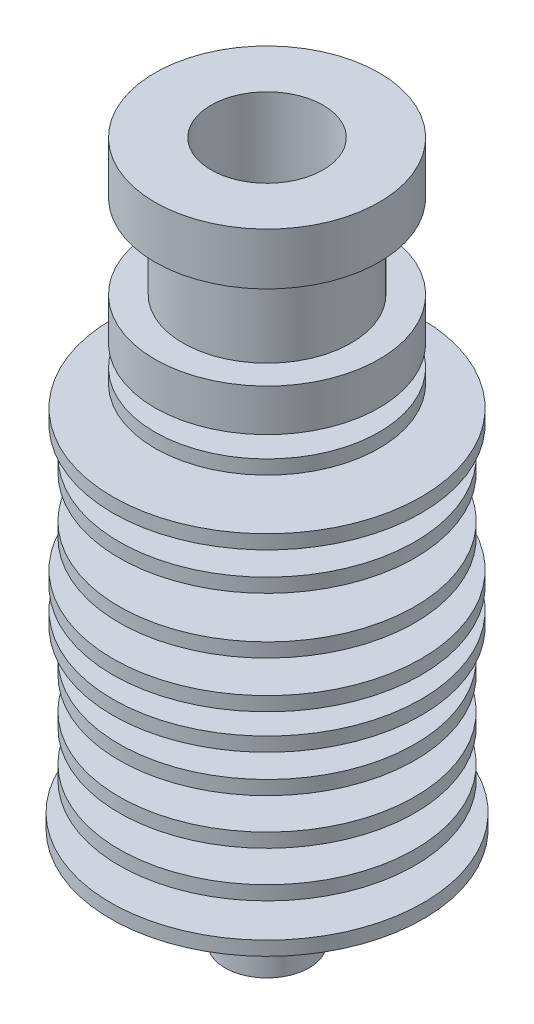
ISO-10303-21;
HEADER;
FILE_DESCRIPTION(('STEP AP214'),'2;1');
FILE_NAME('part.step','',(''),(''),'','','');
FILE_SCHEMA(('AUTOMOTIVE_DESIGN { 1 0 10303 214 1 1 1 1 }'));
ENDSEC;
DATA;
#1=APPLICATION_CONTEXT('core data for automotive mechanical design processes');
#2=APPLICATION_PROTOCOL_DEFINITION('international standard','automotive_design',2000,#1);
#3=PRODUCT_CONTEXT('',#1,'mechanical');
#4=PRODUCT('Part','Part','',(#3));
#5=PRODUCT_RELATED_PRODUCT_CATEGORY('part','',(#4));
#6=PRODUCT_DEFINITION_FORMATION('','',#4);
#7=PRODUCT_DEFINITION_CONTEXT('part definition',#1,'design');
#8=PRODUCT_DEFINITION('design','',#6,#7);
#9=PRODUCT_DEFINITION_SHAPE('','',#8);
#10=(LENGTH_UNIT() NAMED_UNIT(*) SI_UNIT(.MILLI.,.METRE.));
#11=(NAMED_UNIT(*) PLANE_ANGLE_UNIT() SI_UNIT($,.RADIAN.));
#12=(NAMED_UNIT(*) SI_UNIT($,.STERADIAN.) SOLID_ANGLE_UNIT());
#13=UNCERTAINTY_MEASURE_WITH_UNIT(LENGTH_MEASURE(1.E-05),#10,'distance_accuracy_value','');
#14=(GEOMETRIC_REPRESENTATION_CONTEXT(3) GLOBAL_UNCERTAINTY_ASSIGNED_CONTEXT((#13)) GLOBAL_UNIT_ASSIGNED_CONTEXT((#10,
#11,#12)) REPRESENTATION_CONTEXT('',''));
#15=CARTESIAN_POINT('',(0.,0.,0.));
#16=DIRECTION('',(0.,0.,1.));
#17=DIRECTION('',(1.,0.,0.));
#18=AXIS2_PLACEMENT_3D('',#15,#16,#17);
#19=CARTESIAN_POINT('',(0.,0.,0.));
#20=DIRECTION('',(0.,-1.,0.));
#21=DIRECTION('',(0.,0.,-1.));
#22=AXIS2_PLACEMENT_3D('',#19,#20,#21);
#23=CYLINDRICAL_SURFACE('',#22,8.);
#24=CARTESIAN_POINT('',(0.,0.,0.));
#25=DIRECTION('',(0.,-1.,0.));
#26=DIRECTION('',(0.,0.,-1.));
#27=AXIS2_PLACEMENT_3D('',#24,#25,#26);
#28=CIRCLE('',#27,8.);
#29=CARTESIAN_POINT('',(0.,0.,-8.));
#30=VERTEX_POINT('',#29);
#31=EDGE_CURVE('E199',#30,#30,#28,.T.);
#32=ORIENTED_EDGE('',*,*,#31,.T.);
#33=EDGE_LOOP('',(#32));
#34=FACE_BOUND('',#33,.T.);
#35=CARTESIAN_POINT('',(0.,-3.70000000000001,0.));
#36=DIRECTION('',(0.,-1.,0.));
#37=DIRECTION('',(0.,0.,-1.));
#38=AXIS2_PLACEMENT_3D('',#35,#36,#37);
#39=CIRCLE('',#38,8.);
#40=CARTESIAN_POINT('',(0.,-3.70000000000001,-8.));
#41=VERTEX_POINT('',#40);
#42=EDGE_CURVE('E10',#41,#41,#39,.T.);
#43=ORIENTED_EDGE('',*,*,#42,.F.);
#44=EDGE_LOOP('',(#43));
#45=FACE_BOUND('',#44,.T.);
#46=ADVANCED_FACE('F33',(#34,#45),#23,.T.);
#47=CARTESIAN_POINT('',(8.,-3.70000000000001,0.));
#48=DIRECTION('',(0.,-1.,0.));
#49=DIRECTION('',(0.,0.,-1.));
#50=AXIS2_PLACEMENT_3D('',#47,#48,#49);
#51=PLANE('',#50);
#52=ORIENTED_EDGE('',*,*,#42,.T.);
#53=EDGE_LOOP('',(#52));
#54=FACE_BOUND('',#53,.T.);
#55=CARTESIAN_POINT('',(0.,-3.70000000000001,0.));
#56=DIRECTION('',(0.,-1.,0.));
#57=DIRECTION('',(0.,0.,-1.));
#58=AXIS2_PLACEMENT_3D('',#55,#56,#57);
#59=CIRCLE('',#58,6.);
#60=CARTESIAN_POINT('',(0.,-3.70000000000001,-6.));
#61=VERTEX_POINT('',#60);
#62=EDGE_CURVE('E39',#61,#61,#59,.T.);
#63=ORIENTED_EDGE('',*,*,#62,.F.);
#64=EDGE_LOOP('',(#63));
#65=FACE_BOUND('',#64,.T.);
#66=ADVANCED_FACE('F217',(#54,#65),#51,.T.);
#67=CARTESIAN_POINT('',(0.,0.,0.));
#68=DIRECTION('',(0.,-1.,0.));
#69=DIRECTION('',(0.,0.,-1.));
#70=AXIS2_PLACEMENT_3D('',#67,#68,#69);
#71=CYLINDRICAL_SURFACE('',#70,6.);
#72=ORIENTED_EDGE('',*,*,#62,.T.);
#73=EDGE_LOOP('',(#72));
#74=FACE_BOUND('',#73,.T.);
#75=CARTESIAN_POINT('',(0.,-9.70000000000001,0.));
#76=DIRECTION('',(0.,-1.,0.));
#77=DIRECTION('',(0.,0.,-1.));
#78=AXIS2_PLACEMENT_3D('',#75,#76,#77);
#79=CIRCLE('',#78,6.);
#80=CARTESIAN_POINT('',(0.,-9.70000000000001,-6.));
#81=VERTEX_POINT('',#80);
#82=EDGE_CURVE('E43',#81,#81,#79,.T.);
#83=ORIENTED_EDGE('',*,*,#82,.F.);
#84=EDGE_LOOP('',(#83));
#85=FACE_BOUND('',#84,.T.);
#86=ADVANCED_FACE('F221',(#74,#85),#71,.T.);
#87=CARTESIAN_POINT('',(6.,-9.70000000000001,0.));
#88=DIRECTION('',(0.,1.,0.));
#89=DIRECTION('',(0.,0.,1.));
#90=AXIS2_PLACEMENT_3D('',#87,#88,#89);
#91=PLANE('',#90);
#92=ORIENTED_EDGE('',*,*,#82,.T.);
#93=EDGE_LOOP('',(#92));
#94=FACE_BOUND('',#93,.T.);
#95=CARTESIAN_POINT('',(0.,-9.70000000000001,0.));
#96=DIRECTION('',(0.,-1.,0.));
#97=DIRECTION('',(0.,0.,-1.));
#98=AXIS2_PLACEMENT_3D('',#95,#96,#97);
#99=CIRCLE('',#98,8.);
#100=CARTESIAN_POINT('',(0.,-9.70000000000001,-8.));
#101=VERTEX_POINT('',#100);
#102=EDGE_CURVE('E47',#101,#101,#99,.T.);
#103=ORIENTED_EDGE('',*,*,#102,.F.);
#104=EDGE_LOOP('',(#103));
#105=FACE_BOUND('',#104,.T.);
#106=ADVANCED_FACE('F225',(#94,#105),#91,.T.);
#107=CARTESIAN_POINT('',(0.,0.,0.));
#108=DIRECTION('',(0.,-1.,0.));
#109=DIRECTION('',(0.,0.,-1.));
#110=AXIS2_PLACEMENT_3D('',#107,#108,#109);
#111=CYLINDRICAL_SURFACE('',#110,8.);
#112=ORIENTED_EDGE('',*,*,#102,.T.);
#113=EDGE_LOOP('',(#112));
#114=FACE_BOUND('',#113,.T.);
#115=CARTESIAN_POINT('',(0.,-12.7,0.));
#116=DIRECTION('',(0.,-1.,0.));
#117=DIRECTION('',(0.,0.,-1.));
#118=AXIS2_PLACEMENT_3D('',#115,#116,#117);
#119=CIRCLE('',#118,8.);
#120=CARTESIAN_POINT('',(0.,-12.7,-8.));
#121=VERTEX_POINT('',#120);
#122=EDGE_CURVE('E52',#121,#121,#119,.T.);
#123=ORIENTED_EDGE('',*,*,#122,.F.);
#124=EDGE_LOOP('',(#123));
#125=FACE_BOUND('',#124,.T.);
#126=ADVANCED_FACE('F231',(#114,#125),#111,.T.);
#127=CARTESIAN_POINT('',(8.,-12.7,0.));
#128=DIRECTION('',(0.,-1.,0.));
#129=DIRECTION('',(0.,0.,-1.));
#130=AXIS2_PLACEMENT_3D('',#127,#128,#129);
#131=PLANE('',#130);
#132=ORIENTED_EDGE('',*,*,#122,.T.);
#133=EDGE_LOOP('',(#132));
#134=FACE_BOUND('',#133,.T.);
#135=CARTESIAN_POINT('',(0.,-12.7,0.));
#136=DIRECTION('',(0.,-1.,0.));
#137=DIRECTION('',(0.,0.,-1.));
#138=AXIS2_PLACEMENT_3D('',#135,#136,#137);
#139=CIRCLE('',#138,4.5);
#140=CARTESIAN_POINT('',(0.,-12.7,-4.5));
#141=VERTEX_POINT('',#140);
#142=EDGE_CURVE('E55',#141,#141,#139,.T.);
#143=ORIENTED_EDGE('',*,*,#142,.F.);
#144=EDGE_LOOP('',(#143));
#145=FACE_BOUND('',#144,.T.);
#146=ADVANCED_FACE('F235',(#134,#145),#131,.T.);
#147=CARTESIAN_POINT('',(0.,0.,0.));
#148=DIRECTION('',(0.,-1.,0.));
#149=DIRECTION('',(0.,0.,-1.));
#150=AXIS2_PLACEMENT_3D('',#147,#148,#149);
#151=CYLINDRICAL_SURFACE('',#150,4.5);
#152=ORIENTED_EDGE('',*,*,#142,.T.);
#153=EDGE_LOOP('',(#152));
#154=FACE_BOUND('',#153,.T.);
#155=CARTESIAN_POINT('',(0.,-14.2,0.));
#156=DIRECTION('',(0.,-1.,0.));
#157=DIRECTION('',(0.,0.,-1.));
#158=AXIS2_PLACEMENT_3D('',#155,#156,#157);
#159=CIRCLE('',#158,4.5);
#160=CARTESIAN_POINT('',(0.,-14.2,-4.5));
#161=VERTEX_POINT('',#160);
#162=EDGE_CURVE('E58',#161,#161,#159,.T.);
#163=ORIENTED_EDGE('',*,*,#162,.F.);
#164=EDGE_LOOP('',(#163));
#165=FACE_BOUND('',#164,.T.);
#166=ADVANCED_FACE('F239',(#154,#165),#151,.T.);
#167=CARTESIAN_POINT('',(4.5,-14.2,0.));
#168=DIRECTION('',(0.,1.,0.));
#169=DIRECTION('',(0.,0.,1.));
#170=AXIS2_PLACEMENT_3D('',#167,#168,#169);
#171=PLANE('',#170);
#172=ORIENTED_EDGE('',*,*,#162,.T.);
#173=EDGE_LOOP('',(#172));
#174=FACE_BOUND('',#173,.T.);
#175=CARTESIAN_POINT('',(0.,-14.2,0.));
#176=DIRECTION('',(0.,-1.,0.));
#177=DIRECTION('',(0.,0.,-1.));
#178=AXIS2_PLACEMENT_3D('',#175,#176,#177);
#179=CIRCLE('',#178,8.);
#180=CARTESIAN_POINT('',(0.,-14.2,-8.));
#181=VERTEX_POINT('',#180);
#182=EDGE_CURVE('E61',#181,#181,#179,.T.);
#183=ORIENTED_EDGE('',*,*,#182,.F.);
#184=EDGE_LOOP('',(#183));
#185=FACE_BOUND('',#184,.T.);
#186=ADVANCED_FACE('F243',(#174,#185),#171,.T.);
#187=CARTESIAN_POINT('',(0.,0.,0.));
#188=DIRECTION('',(0.,-1.,0.));
#189=DIRECTION('',(0.,0.,-1.));
#190=AXIS2_PLACEMENT_3D('',#187,#188,#189);
#191=CYLINDRICAL_SURFACE('',#190,8.);
#192=ORIENTED_EDGE('',*,*,#182,.T.);
#193=EDGE_LOOP('',(#192));
#194=FACE_BOUND('',#193,.T.);
#195=CARTESIAN_POINT('',(0.,-15.2,0.));
#196=DIRECTION('',(0.,-1.,0.));
#197=DIRECTION('',(0.,0.,-1.));
#198=AXIS2_PLACEMENT_3D('',#195,#196,#197);
#199=CIRCLE('',#198,8.);
#200=CARTESIAN_POINT('',(0.,-15.2,-8.));
#201=VERTEX_POINT('',#200);
#202=EDGE_CURVE('E64',#201,#201,#199,.T.);
#203=ORIENTED_EDGE('',*,*,#202,.F.);
#204=EDGE_LOOP('',(#203));
#205=FACE_BOUND('',#204,.T.);
#206=ADVANCED_FACE('F247',(#194,#205),#191,.T.);
#207=CARTESIAN_POINT('',(8.,-15.2,0.));
#208=DIRECTION('',(0.,-1.,0.));
#209=DIRECTION('',(0.,0.,-1.));
#210=AXIS2_PLACEMENT_3D('',#207,#208,#209);
#211=PLANE('',#210);
#212=ORIENTED_EDGE('',*,*,#202,.T.);
#213=EDGE_LOOP('',(#212));
#214=FACE_BOUND('',#213,.T.);
#215=CARTESIAN_POINT('',(0.,-15.2,0.));
#216=DIRECTION('',(0.,-1.,0.));
#217=DIRECTION('',(0.,0.,-1.));
#218=AXIS2_PLACEMENT_3D('',#215,#216,#217);
#219=CIRCLE('',#218,4.5);
#220=CARTESIAN_POINT('',(0.,-15.2,-4.5));
#221=VERTEX_POINT('',#220);
#222=EDGE_CURVE('E67',#221,#221,#219,.T.);
#223=ORIENTED_EDGE('',*,*,#222,.F.);
#224=EDGE_LOOP('',(#223));
#225=FACE_BOUND('',#224,.T.);
#226=ADVANCED_FACE('F251',(#214,#225),#211,.T.);
#227=CARTESIAN_POINT('',(0.,0.,0.));
#228=DIRECTION('',(0.,-1.,0.));
#229=DIRECTION('',(0.,0.,-1.));
#230=AXIS2_PLACEMENT_3D('',#227,#228,#229);
#231=CYLINDRICAL_SURFACE('',#230,4.5);
#232=ORIENTED_EDGE('',*,*,#222,.T.);
#233=EDGE_LOOP('',(#232));
#234=FACE_BOUND('',#233,.T.);
#235=CARTESIAN_POINT('',(0.,-16.7,0.));
#236=DIRECTION('',(0.,-1.,0.));
#237=DIRECTION('',(0.,0.,-1.));
#238=AXIS2_PLACEMENT_3D('',#235,#236,#237);
#239=CIRCLE('',#238,4.5);
#240=CARTESIAN_POINT('',(0.,-16.7,-4.5));
#241=VERTEX_POINT('',#240);
#242=EDGE_CURVE('E70',#241,#241,#239,.T.);
#243=ORIENTED_EDGE('',*,*,#242,.F.);
#244=EDGE_LOOP('',(#243));
#245=FACE_BOUND('',#244,.T.);
#246=ADVANCED_FACE('F255',(#234,#245),#231,.T.);
#247=CARTESIAN_POINT('',(4.5,-16.7,0.));
#248=DIRECTION('',(0.,1.,0.));
#249=DIRECTION('',(0.,0.,1.));
#250=AXIS2_PLACEMENT_3D('',#247,#248,#249);
#251=PLANE('',#250);
#252=ORIENTED_EDGE('',*,*,#242,.T.);
#253=EDGE_LOOP('',(#252));
#254=FACE_BOUND('',#253,.T.);
#255=CARTESIAN_POINT('',(0.,-16.7,0.));
#256=DIRECTION('',(0.,-1.,0.));
#257=DIRECTION('',(0.,0.,-1.));
#258=AXIS2_PLACEMENT_3D('',#255,#256,#257);
#259=CIRCLE('',#258,11.);
#260=CARTESIAN_POINT('',(0.,-16.7,-11.));
#261=VERTEX_POINT('',#260);
#262=EDGE_CURVE('E73',#261,#261,#259,.T.);
#263=ORIENTED_EDGE('',*,*,#262,.F.);
#264=EDGE_LOOP('',(#263));
#265=FACE_BOUND('',#264,.T.);
#266=ADVANCED_FACE('F259',(#254,#265),#251,.T.);
#267=CARTESIAN_POINT('',(0.,0.,0.));
#268=DIRECTION('',(0.,-1.,0.));
#269=DIRECTION('',(0.,0.,-1.));
#270=AXIS2_PLACEMENT_3D('',#267,#268,#269);
#271=CYLINDRICAL_SURFACE('',#270,11.);
#272=ORIENTED_EDGE('',*,*,#262,.T.);
#273=EDGE_LOOP('',(#272));
#274=FACE_BOUND('',#273,.T.);
#275=CARTESIAN_POINT('',(0.,-17.7,0.));
#276=DIRECTION('',(0.,-1.,0.));
#277=DIRECTION('',(0.,0.,-1.));
#278=AXIS2_PLACEMENT_3D('',#275,#276,#277);
#279=CIRCLE('',#278,11.);
#280=CARTESIAN_POINT('',(0.,-17.7,-11.));
#281=VERTEX_POINT('',#280);
#282=EDGE_CURVE('E76',#281,#281,#279,.T.);
#283=ORIENTED_EDGE('',*,*,#282,.F.);
#284=EDGE_LOOP('',(#283));
#285=FACE_BOUND('',#284,.T.);
#286=ADVANCED_FACE('F263',(#274,#285),#271,.T.);
#287=CARTESIAN_POINT('',(11.,-17.7,0.));
#288=DIRECTION('',(0.,-1.,0.));
#289=DIRECTION('',(0.,0.,-1.));
#290=AXIS2_PLACEMENT_3D('',#287,#288,#289);
#291=PLANE('',#290);
#292=ORIENTED_EDGE('',*,*,#282,.T.);
#293=EDGE_LOOP('',(#292));
#294=FACE_BOUND('',#293,.T.);
#295=CARTESIAN_POINT('',(0.,-17.7,0.));
#296=DIRECTION('',(0.,-1.,0.));
#297=DIRECTION('',(0.,0.,-1.));
#298=AXIS2_PLACEMENT_3D('',#295,#296,#297);
#299=CIRCLE('',#298,3.5);
#300=CARTESIAN_POINT('',(0.,-17.7,-3.5));
#301=VERTEX_POINT('',#300);
#302=EDGE_CURVE('E79',#301,#301,#299,.T.);
#303=ORIENTED_EDGE('',*,*,#302,.F.);
#304=EDGE_LOOP('',(#303));
#305=FACE_BOUND('',#304,.T.);
#306=ADVANCED_FACE('F267',(#294,#305),#291,.T.);
#307=CARTESIAN_POINT('',(0.,0.,0.));
#308=DIRECTION('',(0.,-1.,0.));
#309=DIRECTION('',(0.,0.,-1.));
#310=AXIS2_PLACEMENT_3D('',#307,#308,#309);
#311=CYLINDRICAL_SURFACE('',#310,3.5);
#312=ORIENTED_EDGE('',*,*,#302,.T.);
#313=EDGE_LOOP('',(#312));
#314=FACE_BOUND('',#313,.T.);
#315=CARTESIAN_POINT('',(0.,-19.7,0.));
#316=DIRECTION('',(0.,-1.,0.));
#317=DIRECTION('',(0.,0.,-1.));
#318=AXIS2_PLACEMENT_3D('',#315,#316,#317);
#319=CIRCLE('',#318,3.5);
#320=CARTESIAN_POINT('',(0.,-19.7,-3.5));
#321=VERTEX_POINT('',#320);
#322=EDGE_CURVE('E82',#321,#321,#319,.T.);
#323=ORIENTED_EDGE('',*,*,#322,.F.);
#324=EDGE_LOOP('',(#323));
#325=FACE_BOUND('',#324,.T.);
#326=ADVANCED_FACE('F271',(#314,#325),#311,.T.);
#327=CARTESIAN_POINT('',(3.5,-19.7,0.));
#328=DIRECTION('',(0.,1.,0.));
#329=DIRECTION('',(0.,0.,1.));
#330=AXIS2_PLACEMENT_3D('',#327,#328,#329);
#331=PLANE('',#330);
#332=ORIENTED_EDGE('',*,*,#322,.T.);
#333=EDGE_LOOP('',(#332));
#334=FACE_BOUND('',#333,.T.);
#335=CARTESIAN_POINT('',(0.,-19.7,0.));
#336=DIRECTION('',(0.,-1.,0.));
#337=DIRECTION('',(0.,0.,-1.));
#338=AXIS2_PLACEMENT_3D('',#335,#336,#337);
#339=CIRCLE('',#338,10.55);
#340=CARTESIAN_POINT('',(0.,-19.7,-10.55));
#341=VERTEX_POINT('',#340);
#342=EDGE_CURVE('E85',#341,#341,#339,.T.);
#343=ORIENTED_EDGE('',*,*,#342,.F.);
#344=EDGE_LOOP('',(#343));
#345=FACE_BOUND('',#344,.T.);
#346=ADVANCED_FACE('F275',(#334,#345),#331,.T.);
#347=CARTESIAN_POINT('',(0.,0.,0.));
#348=DIRECTION('',(0.,-1.,0.));
#349=DIRECTION('',(0.,0.,-1.));
#350=AXIS2_PLACEMENT_3D('',#347,#348,#349);
#351=CYLINDRICAL_SURFACE('',#350,10.55);
#352=ORIENTED_EDGE('',*,*,#342,.T.);
#353=EDGE_LOOP('',(#352));
#354=FACE_BOUND('',#353,.T.);
#355=CARTESIAN_POINT('',(0.,-20.7,0.));
#356=DIRECTION('',(0.,-1.,0.));
#357=DIRECTION('',(0.,0.,-1.));
#358=AXIS2_PLACEMENT_3D('',#355,#356,#357);
#359=CIRCLE('',#358,10.55);
#360=CARTESIAN_POINT('',(0.,-20.7,-10.55));
#361=VERTEX_POINT('',#360);
#362=EDGE_CURVE('E88',#361,#361,#359,.T.);
#363=ORIENTED_EDGE('',*,*,#362,.F.);
#364=EDGE_LOOP('',(#363));
#365=FACE_BOUND('',#364,.T.);
#366=ADVANCED_FACE('F279',(#354,#365),#351,.T.);
#367=CARTESIAN_POINT('',(10.55,-20.7,0.));
#368=DIRECTION('',(0.,-1.,0.));
#369=DIRECTION('',(0.,0.,-1.));
#370=AXIS2_PLACEMENT_3D('',#367,#368,#369);
#371=PLANE('',#370);
#372=ORIENTED_EDGE('',*,*,#362,.T.);
#373=EDGE_LOOP('',(#372));
#374=FACE_BOUND('',#373,.T.);
#375=CARTESIAN_POINT('',(0.,-20.7,0.));
#376=DIRECTION('',(0.,-1.,0.));
#377=DIRECTION('',(0.,0.,-1.));
#378=AXIS2_PLACEMENT_3D('',#375,#376,#377);
#379=CIRCLE('',#378,3.05);
#380=CARTESIAN_POINT('',(0.,-20.7,-3.05));
#381=VERTEX_POINT('',#380);
#382=EDGE_CURVE('E91',#381,#381,#379,.T.);
#383=ORIENTED_EDGE('',*,*,#382,.F.);
#384=EDGE_LOOP('',(#383));
#385=FACE_BOUND('',#384,.T.);
#386=ADVANCED_FACE('F283',(#374,#385),#371,.T.);
#387=CARTESIAN_POINT('',(0.,0.,0.));
#388=DIRECTION('',(0.,-1.,0.));
#389=DIRECTION('',(0.,0.,-1.));
#390=AXIS2_PLACEMENT_3D('',#387,#388,#389);
#391=CYLINDRICAL_SURFACE('',#390,3.05);
#392=ORIENTED_EDGE('',*,*,#382,.T.);
#393=EDGE_LOOP('',(#392));
#394=FACE_BOUND('',#393,.T.);
#395=CARTESIAN_POINT('',(0.,-23.7,0.));
#396=DIRECTION('',(0.,-1.,0.));
#397=DIRECTION('',(0.,0.,-1.));
#398=AXIS2_PLACEMENT_3D('',#395,#396,#397);
#399=CIRCLE('',#398,3.05);
#400=CARTESIAN_POINT('',(0.,-23.7,-3.05));
#401=VERTEX_POINT('',#400);
#402=EDGE_CURVE('E94',#401,#401,#399,.T.);
#403=ORIENTED_EDGE('',*,*,#402,.F.);
#404=EDGE_LOOP('',(#403));
#405=FACE_BOUND('',#404,.T.);
#406=ADVANCED_FACE('F287',(#394,#405),#391,.T.);
#407=CARTESIAN_POINT('',(3.05,-23.7,0.));
#408=DIRECTION('',(0.,1.,0.));
#409=DIRECTION('',(0.,0.,1.));
#410=AXIS2_PLACEMENT_3D('',#407,#408,#409);
#411=PLANE('',#410);
#412=ORIENTED_EDGE('',*,*,#402,.T.);
#413=EDGE_LOOP('',(#412));
#414=FACE_BOUND('',#413,.T.);
#415=CARTESIAN_POINT('',(0.,-23.7,0.));
#416=DIRECTION('',(0.,-1.,0.));
#417=DIRECTION('',(0.,0.,-1.));
#418=AXIS2_PLACEMENT_3D('',#415,#416,#417);
#419=CIRCLE('',#418,10.55);
#420=CARTESIAN_POINT('',(0.,-23.7,-10.55));
#421=VERTEX_POINT('',#420);
#422=EDGE_CURVE('E97',#421,#421,#419,.T.);
#423=ORIENTED_EDGE('',*,*,#422,.F.);
#424=EDGE_LOOP('',(#423));
#425=FACE_BOUND('',#424,.T.);
#426=ADVANCED_FACE('F291',(#414,#425),#411,.T.);
#427=CARTESIAN_POINT('',(0.,0.,0.));
#428=DIRECTION('',(0.,-1.,0.));
#429=DIRECTION('',(0.,0.,-1.));
#430=AXIS2_PLACEMENT_3D('',#427,#428,#429);
#431=CYLINDRICAL_SURFACE('',#430,10.55);
#432=ORIENTED_EDGE('',*,*,#422,.T.);
#433=EDGE_LOOP('',(#432));
#434=FACE_BOUND('',#433,.T.);
#435=CARTESIAN_POINT('',(0.,-24.7,0.));
#436=DIRECTION('',(0.,-1.,0.));
#437=DIRECTION('',(0.,0.,-1.));
#438=AXIS2_PLACEMENT_3D('',#435,#436,#437);
#439=CIRCLE('',#438,10.55);
#440=CARTESIAN_POINT('',(0.,-24.7,-10.55));
#441=VERTEX_POINT('',#440);
#442=EDGE_CURVE('E100',#441,#441,#439,.T.);
#443=ORIENTED_EDGE('',*,*,#442,.F.);
#444=EDGE_LOOP('',(#443));
#445=FACE_BOUND('',#444,.T.);
#446=ADVANCED_FACE('F295',(#434,#445),#431,.T.);
#447=CARTESIAN_POINT('',(10.55,-24.7,0.));
#448=DIRECTION('',(0.,-1.,0.));
#449=DIRECTION('',(0.,0.,-1.));
#450=AXIS2_PLACEMENT_3D('',#447,#448,#449);
#451=PLANE('',#450);
#452=ORIENTED_EDGE('',*,*,#442,.T.);
#453=EDGE_LOOP('',(#452));
#454=FACE_BOUND('',#453,.T.);
#455=CARTESIAN_POINT('',(0.,-24.7,0.));
#456=DIRECTION('',(0.,-1.,0.));
#457=DIRECTION('',(0.,0.,-1.));
#458=AXIS2_PLACEMENT_3D('',#455,#456,#457);
#459=CIRCLE('',#458,3.5);
#460=CARTESIAN_POINT('',(0.,-24.7,-3.5));
#461=VERTEX_POINT('',#460);
#462=EDGE_CURVE('E103',#461,#461,#459,.T.);
#463=ORIENTED_EDGE('',*,*,#462,.F.);
#464=EDGE_LOOP('',(#463));
#465=FACE_BOUND('',#464,.T.);
#466=ADVANCED_FACE('F299',(#454,#465),#451,.T.);
#467=CARTESIAN_POINT('',(0.,0.,0.));
#468=DIRECTION('',(0.,-1.,0.));
#469=DIRECTION('',(0.,0.,-1.));
#470=AXIS2_PLACEMENT_3D('',#467,#468,#469);
#471=CYLINDRICAL_SURFACE('',#470,3.5);
#472=ORIENTED_EDGE('',*,*,#462,.T.);
#473=EDGE_LOOP('',(#472));
#474=FACE_BOUND('',#473,.T.);
#475=CARTESIAN_POINT('',(0.,-26.7,0.));
#476=DIRECTION('',(0.,-1.,0.));
#477=DIRECTION('',(0.,0.,-1.));
#478=AXIS2_PLACEMENT_3D('',#475,#476,#477);
#479=CIRCLE('',#478,3.5);
#480=CARTESIAN_POINT('',(0.,-26.7,-3.5));
#481=VERTEX_POINT('',#480);
#482=EDGE_CURVE('E106',#481,#481,#479,.T.);
#483=ORIENTED_EDGE('',*,*,#482,.F.);
#484=EDGE_LOOP('',(#483));
#485=FACE_BOUND('',#484,.T.);
#486=ADVANCED_FACE('F303',(#474,#485),#471,.T.);
#487=CARTESIAN_POINT('',(3.5,-26.7,0.));
#488=DIRECTION('',(0.,1.,0.));
#489=DIRECTION('',(0.,0.,1.));
#490=AXIS2_PLACEMENT_3D('',#487,#488,#489);
#491=PLANE('',#490);
#492=ORIENTED_EDGE('',*,*,#482,.T.);
#493=EDGE_LOOP('',(#492));
#494=FACE_BOUND('',#493,.T.);
#495=CARTESIAN_POINT('',(0.,-26.7,0.));
#496=DIRECTION('',(0.,-1.,0.));
#497=DIRECTION('',(0.,0.,-1.));
#498=AXIS2_PLACEMENT_3D('',#495,#496,#497);
#499=CIRCLE('',#498,11.);
#500=CARTESIAN_POINT('',(0.,-26.7,-11.));
#501=VERTEX_POINT('',#500);
#502=EDGE_CURVE('E109',#501,#501,#499,.T.);
#503=ORIENTED_EDGE('',*,*,#502,.F.);
#504=EDGE_LOOP('',(#503));
#505=FACE_BOUND('',#504,.T.);
#506=ADVANCED_FACE('F307',(#494,#505),#491,.T.);
#507=CARTESIAN_POINT('',(0.,0.,0.));
#508=DIRECTION('',(0.,-1.,0.));
#509=DIRECTION('',(0.,0.,-1.));
#510=AXIS2_PLACEMENT_3D('',#507,#508,#509);
#511=CYLINDRICAL_SURFACE('',#510,11.);
#512=ORIENTED_EDGE('',*,*,#502,.T.);
#513=EDGE_LOOP('',(#512));
#514=FACE_BOUND('',#513,.T.);
#515=CARTESIAN_POINT('',(0.,-27.7,0.));
#516=DIRECTION('',(0.,-1.,0.));
#517=DIRECTION('',(0.,0.,-1.));
#518=AXIS2_PLACEMENT_3D('',#515,#516,#517);
#519=CIRCLE('',#518,11.);
#520=CARTESIAN_POINT('',(0.,-27.7,-11.));
#521=VERTEX_POINT('',#520);
#522=EDGE_CURVE('E112',#521,#521,#519,.T.);
#523=ORIENTED_EDGE('',*,*,#522,.F.);
#524=EDGE_LOOP('',(#523));
#525=FACE_BOUND('',#524,.T.);
#526=ADVANCED_FACE('F311',(#514,#525),#511,.T.);
#527=CARTESIAN_POINT('',(11.,-27.7,0.));
#528=DIRECTION('',(0.,-1.,0.));
#529=DIRECTION('',(0.,0.,-1.));
#530=AXIS2_PLACEMENT_3D('',#527,#528,#529);
#531=PLANE('',#530);
#532=ORIENTED_EDGE('',*,*,#522,.T.);
#533=EDGE_LOOP('',(#532));
#534=FACE_BOUND('',#533,.T.);
#535=CARTESIAN_POINT('',(0.,-27.7,0.));
#536=DIRECTION('',(0.,-1.,0.));
#537=DIRECTION('',(0.,0.,-1.));
#538=AXIS2_PLACEMENT_3D('',#535,#536,#537);
#539=CIRCLE('',#538,7.);
#540=CARTESIAN_POINT('',(0.,-27.7,-7.));
#541=VERTEX_POINT('',#540);
#542=EDGE_CURVE('E115',#541,#541,#539,.T.);
#543=ORIENTED_EDGE('',*,*,#542,.F.);
#544=EDGE_LOOP('',(#543));
#545=FACE_BOUND('',#544,.T.);
#546=ADVANCED_FACE('F315',(#534,#545),#531,.T.);
#547=CARTESIAN_POINT('',(0.,0.,0.));
#548=DIRECTION('',(0.,-1.,0.));
#549=DIRECTION('',(0.,0.,-1.));
#550=AXIS2_PLACEMENT_3D('',#547,#548,#549);
#551=CYLINDRICAL_SURFACE('',#550,7.);
#552=ORIENTED_EDGE('',*,*,#542,.T.);
#553=EDGE_LOOP('',(#552));
#554=FACE_BOUND('',#553,.T.);
#555=CARTESIAN_POINT('',(0.,-29.2,0.));
#556=DIRECTION('',(0.,-1.,0.));
#557=DIRECTION('',(0.,0.,-1.));
#558=AXIS2_PLACEMENT_3D('',#555,#556,#557);
#559=CIRCLE('',#558,7.);
#560=CARTESIAN_POINT('',(0.,-29.2,-7.));
#561=VERTEX_POINT('',#560);
#562=EDGE_CURVE('E118',#561,#561,#559,.T.);
#563=ORIENTED_EDGE('',*,*,#562,.F.);
#564=EDGE_LOOP('',(#563));
#565=FACE_BOUND('',#564,.T.);
#566=ADVANCED_FACE('F319',(#554,#565),#551,.T.);
#567=CARTESIAN_POINT('',(7.,-29.2,0.));
#568=DIRECTION('',(0.,1.,0.));
#569=DIRECTION('',(0.,0.,1.));
#570=AXIS2_PLACEMENT_3D('',#567,#568,#569);
#571=PLANE('',#570);
#572=ORIENTED_EDGE('',*,*,#562,.T.);
#573=EDGE_LOOP('',(#572));
#574=FACE_BOUND('',#573,.T.);
#575=CARTESIAN_POINT('',(0.,-29.2,0.));
#576=DIRECTION('',(0.,-1.,0.));
#577=DIRECTION('',(0.,0.,-1.));
#578=AXIS2_PLACEMENT_3D('',#575,#576,#577);
#579=CIRCLE('',#578,11.);
#580=CARTESIAN_POINT('',(0.,-29.2,-11.));
#581=VERTEX_POINT('',#580);
#582=EDGE_CURVE('E121',#581,#581,#579,.T.);
#583=ORIENTED_EDGE('',*,*,#582,.F.);
#584=EDGE_LOOP('',(#583));
#585=FACE_BOUND('',#584,.T.);
#586=ADVANCED_FACE('F323',(#574,#585),#571,.T.);
#587=CARTESIAN_POINT('',(0.,0.,0.));
#588=DIRECTION('',(0.,-1.,0.));
#589=DIRECTION('',(0.,0.,-1.));
#590=AXIS2_PLACEMENT_3D('',#587,#588,#589);
#591=CYLINDRICAL_SURFACE('',#590,11.);
#592=ORIENTED_EDGE('',*,*,#582,.T.);
#593=EDGE_LOOP('',(#592));
#594=FACE_BOUND('',#593,.T.);
#595=CARTESIAN_POINT('',(0.,-30.2,0.));
#596=DIRECTION('',(0.,-1.,0.));
#597=DIRECTION('',(0.,0.,-1.));
#598=AXIS2_PLACEMENT_3D('',#595,#596,#597);
#599=CIRCLE('',#598,11.);
#600=CARTESIAN_POINT('',(0.,-30.2,-11.));
#601=VERTEX_POINT('',#600);
#602=EDGE_CURVE('E124',#601,#601,#599,.T.);
#603=ORIENTED_EDGE('',*,*,#602,.F.);
#604=EDGE_LOOP('',(#603));
#605=FACE_BOUND('',#604,.T.);
#606=ADVANCED_FACE('F327',(#594,#605),#591,.T.);
#607=CARTESIAN_POINT('',(11.,-30.2,0.));
#608=DIRECTION('',(0.,-1.,0.));
#609=DIRECTION('',(0.,0.,-1.));
#610=AXIS2_PLACEMENT_3D('',#607,#608,#609);
#611=PLANE('',#610);
#612=ORIENTED_EDGE('',*,*,#602,.T.);
#613=EDGE_LOOP('',(#612));
#614=FACE_BOUND('',#613,.T.);
#615=CARTESIAN_POINT('',(0.,-30.2,0.));
#616=DIRECTION('',(0.,-1.,0.));
#617=DIRECTION('',(0.,0.,-1.));
#618=AXIS2_PLACEMENT_3D('',#615,#616,#617);
#619=CIRCLE('',#618,3.5);
#620=CARTESIAN_POINT('',(0.,-30.2,-3.5));
#621=VERTEX_POINT('',#620);
#622=EDGE_CURVE('E127',#621,#621,#619,.T.);
#623=ORIENTED_EDGE('',*,*,#622,.F.);
#624=EDGE_LOOP('',(#623));
#625=FACE_BOUND('',#624,.T.);
#626=ADVANCED_FACE('F331',(#614,#625),#611,.T.);
#627=CARTESIAN_POINT('',(0.,0.,0.));
#628=DIRECTION('',(0.,-1.,0.));
#629=DIRECTION('',(0.,0.,-1.));
#630=AXIS2_PLACEMENT_3D('',#627,#628,#629);
#631=CYLINDRICAL_SURFACE('',#630,3.5);
#632=ORIENTED_EDGE('',*,*,#622,.T.);
#633=EDGE_LOOP('',(#632));
#634=FACE_BOUND('',#633,.T.);
#635=CARTESIAN_POINT('',(0.,-32.2,0.));
#636=DIRECTION('',(0.,-1.,0.));
#637=DIRECTION('',(0.,0.,-1.));
#638=AXIS2_PLACEMENT_3D('',#635,#636,#637);
#639=CIRCLE('',#638,3.5);
#640=CARTESIAN_POINT('',(0.,-32.2,-3.5));
#641=VERTEX_POINT('',#640);
#642=EDGE_CURVE('E130',#641,#641,#639,.T.);
#643=ORIENTED_EDGE('',*,*,#642,.F.);
#644=EDGE_LOOP('',(#643));
#645=FACE_BOUND('',#644,.T.);
#646=ADVANCED_FACE('F335',(#634,#645),#631,.T.);
#647=CARTESIAN_POINT('',(3.5,-32.2,0.));
#648=DIRECTION('',(0.,1.,0.));
#649=DIRECTION('',(0.,0.,1.));
#650=AXIS2_PLACEMENT_3D('',#647,#648,#649);
#651=PLANE('',#650);
#652=ORIENTED_EDGE('',*,*,#642,.T.);
#653=EDGE_LOOP('',(#652));
#654=FACE_BOUND('',#653,.T.);
#655=CARTESIAN_POINT('',(0.,-32.2,0.));
#656=DIRECTION('',(0.,-1.,0.));
#657=DIRECTION('',(0.,0.,-1.));
#658=AXIS2_PLACEMENT_3D('',#655,#656,#657);
#659=CIRCLE('',#658,10.55);
#660=CARTESIAN_POINT('',(0.,-32.2,-10.55));
#661=VERTEX_POINT('',#660);
#662=EDGE_CURVE('E133',#661,#661,#659,.T.);
#663=ORIENTED_EDGE('',*,*,#662,.F.);
#664=EDGE_LOOP('',(#663));
#665=FACE_BOUND('',#664,.T.);
#666=ADVANCED_FACE('F339',(#654,#665),#651,.T.);
#667=CARTESIAN_POINT('',(0.,0.,0.));
#668=DIRECTION('',(0.,-1.,0.));
#669=DIRECTION('',(0.,0.,-1.));
#670=AXIS2_PLACEMENT_3D('',#667,#668,#669);
#671=CYLINDRICAL_SURFACE('',#670,10.55);
#672=ORIENTED_EDGE('',*,*,#662,.T.);
#673=EDGE_LOOP('',(#672));
#674=FACE_BOUND('',#673,.T.);
#675=CARTESIAN_POINT('',(0.,-33.2,0.));
#676=DIRECTION('',(0.,-1.,0.));
#677=DIRECTION('',(0.,0.,-1.));
#678=AXIS2_PLACEMENT_3D('',#675,#676,#677);
#679=CIRCLE('',#678,10.55);
#680=CARTESIAN_POINT('',(0.,-33.2,-10.55));
#681=VERTEX_POINT('',#680);
#682=EDGE_CURVE('E136',#681,#681,#679,.T.);
#683=ORIENTED_EDGE('',*,*,#682,.F.);
#684=EDGE_LOOP('',(#683));
#685=FACE_BOUND('',#684,.T.);
#686=ADVANCED_FACE('F343',(#674,#685),#671,.T.);
#687=CARTESIAN_POINT('',(10.55,-33.2,0.));
#688=DIRECTION('',(0.,-1.,0.));
#689=DIRECTION('',(0.,0.,-1.));
#690=AXIS2_PLACEMENT_3D('',#687,#688,#689);
#691=PLANE('',#690);
#692=ORIENTED_EDGE('',*,*,#682,.T.);
#693=EDGE_LOOP('',(#692));
#694=FACE_BOUND('',#693,.T.);
#695=CARTESIAN_POINT('',(0.,-33.2,0.));
#696=DIRECTION('',(0.,-1.,0.));
#697=DIRECTION('',(0.,0.,-1.));
#698=AXIS2_PLACEMENT_3D('',#695,#696,#697);
#699=CIRCLE('',#698,3.05);
#700=CARTESIAN_POINT('',(0.,-33.2,-3.05));
#701=VERTEX_POINT('',#700);
#702=EDGE_CURVE('E139',#701,#701,#699,.T.);
#703=ORIENTED_EDGE('',*,*,#702,.F.);
#704=EDGE_LOOP('',(#703));
#705=FACE_BOUND('',#704,.T.);
#706=ADVANCED_FACE('F347',(#694,#705),#691,.T.);
#707=CARTESIAN_POINT('',(0.,0.,0.));
#708=DIRECTION('',(0.,-1.,0.));
#709=DIRECTION('',(0.,0.,-1.));
#710=AXIS2_PLACEMENT_3D('',#707,#708,#709);
#711=CYLINDRICAL_SURFACE('',#710,3.05);
#712=ORIENTED_EDGE('',*,*,#702,.T.);
#713=EDGE_LOOP('',(#712));
#714=FACE_BOUND('',#713,.T.);
#715=CARTESIAN_POINT('',(0.,-35.45,0.));
#716=DIRECTION('',(0.,-1.,0.));
#717=DIRECTION('',(0.,0.,-1.));
#718=AXIS2_PLACEMENT_3D('',#715,#716,#717);
#719=CIRCLE('',#718,3.05);
#720=CARTESIAN_POINT('',(0.,-35.45,-3.05));
#721=VERTEX_POINT('',#720);
#722=EDGE_CURVE('E142',#721,#721,#719,.T.);
#723=ORIENTED_EDGE('',*,*,#722,.F.);
#724=EDGE_LOOP('',(#723));
#725=FACE_BOUND('',#724,.T.);
#726=ADVANCED_FACE('F351',(#714,#725),#711,.T.);
#727=CARTESIAN_POINT('',(3.05,-35.45,0.));
#728=DIRECTION('',(0.,1.,0.));
#729=DIRECTION('',(0.,0.,1.));
#730=AXIS2_PLACEMENT_3D('',#727,#728,#729);
#731=PLANE('',#730);
#732=ORIENTED_EDGE('',*,*,#722,.T.);
#733=EDGE_LOOP('',(#732));
#734=FACE_BOUND('',#733,.T.);
#735=CARTESIAN_POINT('',(0.,-35.45,0.));
#736=DIRECTION('',(0.,-1.,0.));
#737=DIRECTION('',(0.,0.,-1.));
#738=AXIS2_PLACEMENT_3D('',#735,#736,#737);
#739=CIRCLE('',#738,10.55);
#740=CARTESIAN_POINT('',(0.,-35.45,-10.55));
#741=VERTEX_POINT('',#740);
#742=EDGE_CURVE('E145',#741,#741,#739,.T.);
#743=ORIENTED_EDGE('',*,*,#742,.F.);
#744=EDGE_LOOP('',(#743));
#745=FACE_BOUND('',#744,.T.);
#746=ADVANCED_FACE('F355',(#734,#745),#731,.T.);
#747=CARTESIAN_POINT('',(0.,0.,0.));
#748=DIRECTION('',(0.,-1.,0.));
#749=DIRECTION('',(0.,0.,-1.));
#750=AXIS2_PLACEMENT_3D('',#747,#748,#749);
#751=CYLINDRICAL_SURFACE('',#750,10.55);
#752=ORIENTED_EDGE('',*,*,#742,.T.);
#753=EDGE_LOOP('',(#752));
#754=FACE_BOUND('',#753,.T.);
#755=CARTESIAN_POINT('',(0.,-36.45,0.));
#756=DIRECTION('',(0.,-1.,0.));
#757=DIRECTION('',(0.,0.,-1.));
#758=AXIS2_PLACEMENT_3D('',#755,#756,#757);
#759=CIRCLE('',#758,10.55);
#760=CARTESIAN_POINT('',(0.,-36.45,-10.55));
#761=VERTEX_POINT('',#760);
#762=EDGE_CURVE('E148',#761,#761,#759,.T.);
#763=ORIENTED_EDGE('',*,*,#762,.F.);
#764=EDGE_LOOP('',(#763));
#765=FACE_BOUND('',#764,.T.);
#766=ADVANCED_FACE('F359',(#754,#765),#751,.T.);
#767=CARTESIAN_POINT('',(10.55,-36.45,0.));
#768=DIRECTION('',(0.,-1.,0.));
#769=DIRECTION('',(0.,0.,-1.));
#770=AXIS2_PLACEMENT_3D('',#767,#768,#769);
#771=PLANE('',#770);
#772=ORIENTED_EDGE('',*,*,#762,.T.);
#773=EDGE_LOOP('',(#772));
#774=FACE_BOUND('',#773,.T.);
#775=CARTESIAN_POINT('',(0.,-36.45,0.));
#776=DIRECTION('',(0.,-1.,0.));
#777=DIRECTION('',(0.,0.,-1.));
#778=AXIS2_PLACEMENT_3D('',#775,#776,#777);
#779=CIRCLE('',#778,3.05);
#780=CARTESIAN_POINT('',(0.,-36.45,-3.05));
#781=VERTEX_POINT('',#780);
#782=EDGE_CURVE('E151',#781,#781,#779,.T.);
#783=ORIENTED_EDGE('',*,*,#782,.F.);
#784=EDGE_LOOP('',(#783));
#785=FACE_BOUND('',#784,.T.);
#786=ADVANCED_FACE('F363',(#774,#785),#771,.T.);
#787=CARTESIAN_POINT('',(0.,0.,0.));
#788=DIRECTION('',(0.,-1.,0.));
#789=DIRECTION('',(0.,0.,-1.));
#790=AXIS2_PLACEMENT_3D('',#787,#788,#789);
#791=CYLINDRICAL_SURFACE('',#790,3.05);
#792=ORIENTED_EDGE('',*,*,#782,.T.);
#793=EDGE_LOOP('',(#792));
#794=FACE_BOUND('',#793,.T.);
#795=CARTESIAN_POINT('',(0.,-38.7,0.));
#796=DIRECTION('',(0.,-1.,0.));
#797=DIRECTION('',(0.,0.,-1.));
#798=AXIS2_PLACEMENT_3D('',#795,#796,#797);
#799=CIRCLE('',#798,3.05);
#800=CARTESIAN_POINT('',(0.,-38.7,-3.05));
#801=VERTEX_POINT('',#800);
#802=EDGE_CURVE('E154',#801,#801,#799,.T.);
#803=ORIENTED_EDGE('',*,*,#802,.F.);
#804=EDGE_LOOP('',(#803));
#805=FACE_BOUND('',#804,.T.);
#806=ADVANCED_FACE('F367',(#794,#805),#791,.T.);
#807=CARTESIAN_POINT('',(3.05,-38.7,0.));
#808=DIRECTION('',(0.,1.,0.));
#809=DIRECTION('',(0.,0.,1.));
#810=AXIS2_PLACEMENT_3D('',#807,#808,#809);
#811=PLANE('',#810);
#812=ORIENTED_EDGE('',*,*,#802,.T.);
#813=EDGE_LOOP('',(#812));
#814=FACE_BOUND('',#813,.T.);
#815=CARTESIAN_POINT('',(0.,-38.7,0.));
#816=DIRECTION('',(0.,-1.,0.));
#817=DIRECTION('',(0.,0.,-1.));
#818=AXIS2_PLACEMENT_3D('',#815,#816,#817);
#819=CIRCLE('',#818,10.55);
#820=CARTESIAN_POINT('',(0.,-38.7,-10.55));
#821=VERTEX_POINT('',#820);
#822=EDGE_CURVE('E157',#821,#821,#819,.T.);
#823=ORIENTED_EDGE('',*,*,#822,.F.);
#824=EDGE_LOOP('',(#823));
#825=FACE_BOUND('',#824,.T.);
#826=ADVANCED_FACE('F371',(#814,#825),#811,.T.);
#827=CARTESIAN_POINT('',(0.,0.,0.));
#828=DIRECTION('',(0.,-1.,0.));
#829=DIRECTION('',(0.,0.,-1.));
#830=AXIS2_PLACEMENT_3D('',#827,#828,#829);
#831=CYLINDRICAL_SURFACE('',#830,10.55);
#832=ORIENTED_EDGE('',*,*,#822,.T.);
#833=EDGE_LOOP('',(#832));
#834=FACE_BOUND('',#833,.T.);
#835=CARTESIAN_POINT('',(0.,-39.7,0.));
#836=DIRECTION('',(0.,-1.,0.));
#837=DIRECTION('',(0.,0.,-1.));
#838=AXIS2_PLACEMENT_3D('',#835,#836,#837);
#839=CIRCLE('',#838,10.55);
#840=CARTESIAN_POINT('',(0.,-39.7,-10.55));
#841=VERTEX_POINT('',#840);
#842=EDGE_CURVE('E160',#841,#841,#839,.T.);
#843=ORIENTED_EDGE('',*,*,#842,.F.);
#844=EDGE_LOOP('',(#843));
#845=FACE_BOUND('',#844,.T.);
#846=ADVANCED_FACE('F375',(#834,#845),#831,.T.);
#847=CARTESIAN_POINT('',(10.55,-39.7,0.));
#848=DIRECTION('',(0.,-1.,0.));
#849=DIRECTION('',(0.,0.,-1.));
#850=AXIS2_PLACEMENT_3D('',#847,#848,#849);
#851=PLANE('',#850);
#852=ORIENTED_EDGE('',*,*,#842,.T.);
#853=EDGE_LOOP('',(#852));
#854=FACE_BOUND('',#853,.T.);
#855=CARTESIAN_POINT('',(0.,-39.7,0.));
#856=DIRECTION('',(0.,-1.,0.));
#857=DIRECTION('',(0.,0.,-1.));
#858=AXIS2_PLACEMENT_3D('',#855,#856,#857);
#859=CIRCLE('',#858,3.65);
#860=CARTESIAN_POINT('',(0.,-39.7,-3.65));
#861=VERTEX_POINT('',#860);
#862=EDGE_CURVE('E163',#861,#861,#859,.T.);
#863=ORIENTED_EDGE('',*,*,#862,.F.);
#864=EDGE_LOOP('',(#863));
#865=FACE_BOUND('',#864,.T.);
#866=ADVANCED_FACE('F379',(#854,#865),#851,.T.);
#867=CARTESIAN_POINT('',(0.,0.,0.));
#868=DIRECTION('',(0.,-1.,0.));
#869=DIRECTION('',(0.,0.,-1.));
#870=AXIS2_PLACEMENT_3D('',#867,#868,#869);
#871=CYLINDRICAL_SURFACE('',#870,3.65);
#872=ORIENTED_EDGE('',*,*,#862,.T.);
#873=EDGE_LOOP('',(#872));
#874=FACE_BOUND('',#873,.T.);
#875=CARTESIAN_POINT('',(0.,-41.7,0.));
#876=DIRECTION('',(0.,-1.,0.));
#877=DIRECTION('',(0.,0.,-1.));
#878=AXIS2_PLACEMENT_3D('',#875,#876,#877);
#879=CIRCLE('',#878,3.65);
#880=CARTESIAN_POINT('',(0.,-41.7,-3.65));
#881=VERTEX_POINT('',#880);
#882=EDGE_CURVE('E166',#881,#881,#879,.T.);
#883=ORIENTED_EDGE('',*,*,#882,.F.);
#884=EDGE_LOOP('',(#883));
#885=FACE_BOUND('',#884,.T.);
#886=ADVANCED_FACE('F383',(#874,#885),#871,.T.);
#887=CARTESIAN_POINT('',(3.65,-41.7,0.));
#888=DIRECTION('',(0.,1.,0.));
#889=DIRECTION('',(0.,0.,1.));
#890=AXIS2_PLACEMENT_3D('',#887,#888,#889);
#891=PLANE('',#890);
#892=ORIENTED_EDGE('',*,*,#882,.T.);
#893=EDGE_LOOP('',(#892));
#894=FACE_BOUND('',#893,.T.);
#895=CARTESIAN_POINT('',(0.,-41.7,0.));
#896=DIRECTION('',(0.,-1.,0.));
#897=DIRECTION('',(0.,0.,-1.));
#898=AXIS2_PLACEMENT_3D('',#895,#896,#897);
#899=CIRCLE('',#898,11.15);
#900=CARTESIAN_POINT('',(0.,-41.7,-11.15));
#901=VERTEX_POINT('',#900);
#902=EDGE_CURVE('E169',#901,#901,#899,.T.);
#903=ORIENTED_EDGE('',*,*,#902,.F.);
#904=EDGE_LOOP('',(#903));
#905=FACE_BOUND('',#904,.T.);
#906=ADVANCED_FACE('F387',(#894,#905),#891,.T.);
#907=CARTESIAN_POINT('',(0.,0.,0.));
#908=DIRECTION('',(0.,-1.,0.));
#909=DIRECTION('',(0.,0.,-1.));
#910=AXIS2_PLACEMENT_3D('',#907,#908,#909);
#911=CYLINDRICAL_SURFACE('',#910,11.15);
#912=ORIENTED_EDGE('',*,*,#902,.T.);
#913=EDGE_LOOP('',(#912));
#914=FACE_BOUND('',#913,.T.);
#915=CARTESIAN_POINT('',(0.,-42.7,0.));
#916=DIRECTION('',(0.,-1.,0.));
#917=DIRECTION('',(0.,0.,-1.));
#918=AXIS2_PLACEMENT_3D('',#915,#916,#917);
#919=CIRCLE('',#918,11.15);
#920=CARTESIAN_POINT('',(0.,-42.7,-11.15));
#921=VERTEX_POINT('',#920);
#922=EDGE_CURVE('E172',#921,#921,#919,.T.);
#923=ORIENTED_EDGE('',*,*,#922,.F.);
#924=EDGE_LOOP('',(#923));
#925=FACE_BOUND('',#924,.T.);
#926=ADVANCED_FACE('F391',(#914,#925),#911,.T.);
#927=CARTESIAN_POINT('',(11.15,-42.7,0.));
#928=DIRECTION('',(0.,-1.,0.));
#929=DIRECTION('',(0.,0.,-1.));
#930=AXIS2_PLACEMENT_3D('',#927,#928,#929);
#931=PLANE('',#930);
#932=ORIENTED_EDGE('',*,*,#922,.T.);
#933=EDGE_LOOP('',(#932));
#934=FACE_BOUND('',#933,.T.);
#935=CARTESIAN_POINT('',(0.,-42.7,0.));
#936=DIRECTION('',(0.,-1.,0.));
#937=DIRECTION('',(0.,0.,-1.));
#938=AXIS2_PLACEMENT_3D('',#935,#936,#937);
#939=CIRCLE('',#938,2.75);
#940=CARTESIAN_POINT('',(0.,-42.7,-2.75));
#941=VERTEX_POINT('',#940);
#942=EDGE_CURVE('E175',#941,#941,#939,.T.);
#943=ORIENTED_EDGE('',*,*,#942,.F.);
#944=EDGE_LOOP('',(#943));
#945=FACE_BOUND('',#944,.T.);
#946=ADVANCED_FACE('F395',(#934,#945),#931,.T.);
#947=CARTESIAN_POINT('',(0.,0.,0.));
#948=DIRECTION('',(0.,-1.,0.));
#949=DIRECTION('',(0.,0.,-1.));
#950=AXIS2_PLACEMENT_3D('',#947,#948,#949);
#951=CYLINDRICAL_SURFACE('',#950,2.75);
#952=ORIENTED_EDGE('',*,*,#942,.T.);
#953=EDGE_LOOP('',(#952));
#954=FACE_BOUND('',#953,.T.);
#955=CARTESIAN_POINT('',(0.,-44.8,0.));
#956=DIRECTION('',(0.,-1.,0.));
#957=DIRECTION('',(0.,0.,-1.));
#958=AXIS2_PLACEMENT_3D('',#955,#956,#957);
#959=CIRCLE('',#958,2.75);
#960=CARTESIAN_POINT('',(0.,-44.8,-2.75));
#961=VERTEX_POINT('',#960);
#962=EDGE_CURVE('E178',#961,#961,#959,.T.);
#963=ORIENTED_EDGE('',*,*,#962,.F.);
#964=EDGE_LOOP('',(#963));
#965=FACE_BOUND('',#964,.T.);
#966=ADVANCED_FACE('F399',(#954,#965),#951,.T.);
#967=CARTESIAN_POINT('',(2.75,-44.8,0.));
#968=DIRECTION('',(0.,1.,0.));
#969=DIRECTION('',(0.,0.,1.));
#970=AXIS2_PLACEMENT_3D('',#967,#968,#969);
#971=PLANE('',#970);
#972=ORIENTED_EDGE('',*,*,#962,.T.);
#973=EDGE_LOOP('',(#972));
#974=FACE_BOUND('',#973,.T.);
#975=CARTESIAN_POINT('',(0.,-44.8,0.));
#976=DIRECTION('',(0.,-1.,0.));
#977=DIRECTION('',(0.,0.,-1.));
#978=AXIS2_PLACEMENT_3D('',#975,#976,#977);
#979=CIRCLE('',#978,3.);
#980=CARTESIAN_POINT('',(0.,-44.8,-3.));
#981=VERTEX_POINT('',#980);
#982=EDGE_CURVE('E181',#981,#981,#979,.T.);
#983=ORIENTED_EDGE('',*,*,#982,.F.);
#984=EDGE_LOOP('',(#983));
#985=FACE_BOUND('',#984,.T.);
#986=ADVANCED_FACE('F403',(#974,#985),#971,.T.);
#987=CARTESIAN_POINT('',(0.,0.,0.));
#988=DIRECTION('',(0.,-1.,0.));
#989=DIRECTION('',(0.,0.,-1.));
#990=AXIS2_PLACEMENT_3D('',#987,#988,#989);
#991=CYLINDRICAL_SURFACE('',#990,3.);
#992=ORIENTED_EDGE('',*,*,#982,.T.);
#993=EDGE_LOOP('',(#992));
#994=FACE_BOUND('',#993,.T.);
#995=CARTESIAN_POINT('',(0.,-49.8,0.));
#996=DIRECTION('',(0.,-1.,0.));
#997=DIRECTION('',(0.,0.,-1.));
#998=AXIS2_PLACEMENT_3D('',#995,#996,#997);
#999=CIRCLE('',#998,3.);
#1000=CARTESIAN_POINT('',(0.,-49.8,-3.));
#1001=VERTEX_POINT('',#1000);
#1002=EDGE_CURVE('E184',#1001,#1001,#999,.T.);
#1003=ORIENTED_EDGE('',*,*,#1002,.F.);
#1004=EDGE_LOOP('',(#1003));
#1005=FACE_BOUND('',#1004,.T.);
#1006=ADVANCED_FACE('F407',(#994,#1005),#991,.T.);
#1007=CARTESIAN_POINT('',(3.,-49.8,0.));
#1008=DIRECTION('',(0.,-1.,0.));
#1009=DIRECTION('',(0.,0.,-1.));
#1010=AXIS2_PLACEMENT_3D('',#1007,#1008,#1009);
#1011=PLANE('',#1010);
#1012=ORIENTED_EDGE('',*,*,#1002,.T.);
#1013=EDGE_LOOP('',(#1012));
#1014=FACE_BOUND('',#1013,.T.);
#1015=CARTESIAN_POINT('',(0.,-49.8,0.));
#1016=DIRECTION('',(0.,-1.,0.));
#1017=DIRECTION('',(0.,0.,-1.));
#1018=AXIS2_PLACEMENT_3D('',#1015,#1016,#1017);
#1019=CIRCLE('',#1018,2.00000000000001);
#1020=CARTESIAN_POINT('',(0.,-49.8,-2.00000000000001));
#1021=VERTEX_POINT('',#1020);
#1022=EDGE_CURVE('E187',#1021,#1021,#1019,.T.);
#1023=ORIENTED_EDGE('',*,*,#1022,.F.);
#1024=EDGE_LOOP('',(#1023));
#1025=FACE_BOUND('',#1024,.T.);
#1026=ADVANCED_FACE('F411',(#1014,#1025),#1011,.T.);
#1027=CARTESIAN_POINT('',(0.,0.,0.));
#1028=DIRECTION('',(0.,-1.,0.));
#1029=DIRECTION('',(0.,0.,-1.));
#1030=AXIS2_PLACEMENT_3D('',#1027,#1028,#1029);
#1031=CYLINDRICAL_SURFACE('',#1030,2.);
#1032=ORIENTED_EDGE('',*,*,#1022,.T.);
#1033=EDGE_LOOP('',(#1032));
#1034=FACE_BOUND('',#1033,.T.);
#1035=CARTESIAN_POINT('',(0.,-7.90041507641941,0.));
#1036=DIRECTION('',(0.,-1.,0.));
#1037=DIRECTION('',(0.,0.,-1.));
#1038=AXIS2_PLACEMENT_3D('',#1035,#1036,#1037);
#1039=CIRCLE('',#1038,2.);
#1040=CARTESIAN_POINT('',(0.,-7.90041507641941,-2.));
#1041=VERTEX_POINT('',#1040);
#1042=EDGE_CURVE('E190',#1041,#1041,#1039,.T.);
#1043=ORIENTED_EDGE('',*,*,#1042,.F.);
#1044=EDGE_LOOP('',(#1043));
#1045=FACE_BOUND('',#1044,.T.);
#1046=ADVANCED_FACE('F415',(#1034,#1045),#1031,.F.);
#1047=CARTESIAN_POINT('',(0.,-6.5,0.));
#1048=DIRECTION('',(0.,1.,0.));
#1049=DIRECTION('',(0.,0.,1.));
#1050=AXIS2_PLACEMENT_3D('',#1047,#1048,#1049);
#1051=CONICAL_SURFACE('',#1050,4.,0.959931088596884);
#1052=ORIENTED_EDGE('',*,*,#1042,.T.);
#1053=EDGE_LOOP('',(#1052));
#1054=FACE_BOUND('',#1053,.T.);
#1055=CARTESIAN_POINT('',(0.,-6.5,0.));
#1056=DIRECTION('',(0.,-1.,0.));
#1057=DIRECTION('',(0.,0.,-1.));
#1058=AXIS2_PLACEMENT_3D('',#1055,#1056,#1057);
#1059=CIRCLE('',#1058,4.);
#1060=CARTESIAN_POINT('',(0.,-6.5,-4.));
#1061=VERTEX_POINT('',#1060);
#1062=EDGE_CURVE('E193',#1061,#1061,#1059,.T.);
#1063=ORIENTED_EDGE('',*,*,#1062,.F.);
#1064=EDGE_LOOP('',(#1063));
#1065=FACE_BOUND('',#1064,.T.);
#1066=ADVANCED_FACE('F213',(#1054,#1065),#1051,.F.);
#1067=CARTESIAN_POINT('',(0.,0.,0.));
#1068=DIRECTION('',(0.,-1.,0.));
#1069=DIRECTION('',(0.,0.,-1.));
#1070=AXIS2_PLACEMENT_3D('',#1067,#1068,#1069);
#1071=CYLINDRICAL_SURFACE('',#1070,4.);
#1072=ORIENTED_EDGE('',*,*,#1062,.T.);
#1073=EDGE_LOOP('',(#1072));
#1074=FACE_BOUND('',#1073,.T.);
#1075=CARTESIAN_POINT('',(0.,0.,0.));
#1076=DIRECTION('',(0.,-1.,0.));
#1077=DIRECTION('',(0.,0.,-1.));
#1078=AXIS2_PLACEMENT_3D('',#1075,#1076,#1077);
#1079=CIRCLE('',#1078,4.);
#1080=CARTESIAN_POINT('',(0.,0.,-4.));
#1081=VERTEX_POINT('',#1080);
#1082=EDGE_CURVE('E196',#1081,#1081,#1079,.T.);
#1083=ORIENTED_EDGE('',*,*,#1082,.F.);
#1084=EDGE_LOOP('',(#1083));
#1085=FACE_BOUND('',#1084,.T.);
#1086=ADVANCED_FACE('F207',(#1074,#1085),#1071,.F.);
#1087=CARTESIAN_POINT('',(4.,0.,0.));
#1088=DIRECTION('',(0.,1.,0.));
#1089=DIRECTION('',(0.,0.,1.));
#1090=AXIS2_PLACEMENT_3D('',#1087,#1088,#1089);
#1091=PLANE('',#1090);
#1092=ORIENTED_EDGE('',*,*,#1082,.T.);
#1093=EDGE_LOOP('',(#1092));
#1094=FACE_BOUND('',#1093,.T.);
#1095=ORIENTED_EDGE('',*,*,#31,.F.);
#1096=EDGE_LOOP('',(#1095));
#1097=FACE_BOUND('',#1096,.T.);
#1098=ADVANCED_FACE('F205',(#1094,#1097),#1091,.T.);
#1099=CLOSED_SHELL('',(#46,#66,#86,#106,#126,#146,#166,#186,#206,#226,#246,#266,#286,#306,#326,
#346,#366,#386,#406,#426,#446,#466,#486,#506,#526,#546,#566,#586,#606,#626,#646,#666,#686,#706,
#726,#746,#766,#786,#806,#826,#846,#866,#886,#906,#926,#946,#966,#986,#1006,#1026,#1046,#1066,
#1086,#1098));
#1100=MANIFOLD_SOLID_BREP('B2',#1099);
#1101=ADVANCED_BREP_SHAPE_REPRESENTATION('',(#18,#1100),#14);
#1102=SHAPE_DEFINITION_REPRESENTATION(#9,#1101);
ENDSEC;
END-ISO-10303-21;
